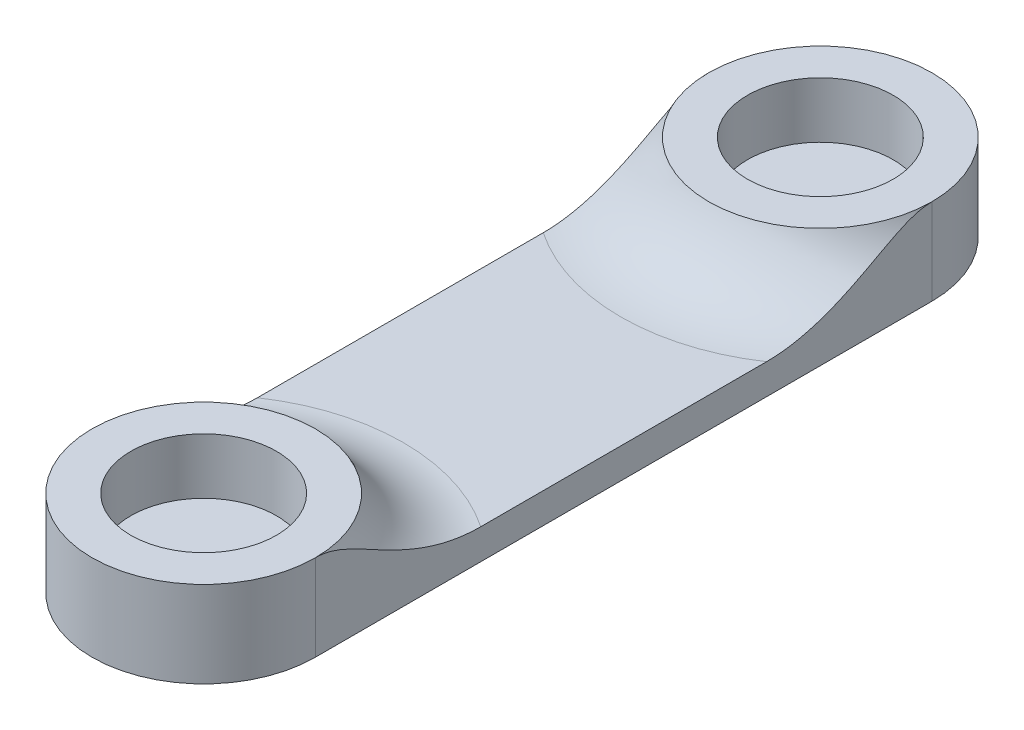
ISO-10303-21;
HEADER;
FILE_DESCRIPTION(('STEP AP214'),'2;1');
FILE_NAME('part.step','',(''),(''),'','','');
FILE_SCHEMA(('AUTOMOTIVE_DESIGN { 1 0 10303 214 1 1 1 1 }'));
ENDSEC;
DATA;
#1=APPLICATION_CONTEXT('core data for automotive mechanical design processes');
#2=APPLICATION_PROTOCOL_DEFINITION('international standard','automotive_design',2000,#1);
#3=PRODUCT_CONTEXT('',#1,'mechanical');
#4=PRODUCT('Part','Part','',(#3));
#5=PRODUCT_RELATED_PRODUCT_CATEGORY('part','',(#4));
#6=PRODUCT_DEFINITION_FORMATION('','',#4);
#7=PRODUCT_DEFINITION_CONTEXT('part definition',#1,'design');
#8=PRODUCT_DEFINITION('design','',#6,#7);
#9=PRODUCT_DEFINITION_SHAPE('','',#8);
#10=(LENGTH_UNIT() NAMED_UNIT(*) SI_UNIT(.MILLI.,.METRE.));
#11=(NAMED_UNIT(*) PLANE_ANGLE_UNIT() SI_UNIT($,.RADIAN.));
#12=(NAMED_UNIT(*) SI_UNIT($,.STERADIAN.) SOLID_ANGLE_UNIT());
#13=UNCERTAINTY_MEASURE_WITH_UNIT(LENGTH_MEASURE(1.E-05),#10,'distance_accuracy_value','');
#14=(GEOMETRIC_REPRESENTATION_CONTEXT(3) GLOBAL_UNCERTAINTY_ASSIGNED_CONTEXT((#13)) GLOBAL_UNIT_ASSIGNED_CONTEXT((#10,
#11,#12)) REPRESENTATION_CONTEXT('',''));
#15=CARTESIAN_POINT('',(0.,0.,0.));
#16=DIRECTION('',(0.,0.,1.));
#17=DIRECTION('',(1.,0.,0.));
#18=AXIS2_PLACEMENT_3D('',#15,#16,#17);
#19=CARTESIAN_POINT('',(11.5000000000002,3.125,0.));
#20=DIRECTION('',(1.,0.,0.));
#21=DIRECTION('',(0.,0.,-1.));
#22=AXIS2_PLACEMENT_3D('',#19,#20,#21);
#23=PLANE('',#22);
#24=DIRECTION('',(0.,0.,1.));
#25=VECTOR('',#24,1.);
#26=CARTESIAN_POINT('',(11.5000000000002,0.,0.));
#27=LINE('',#26,#25);
#28=CARTESIAN_POINT('',(11.5000000000001,0.,69.8377694053405));
#29=VERTEX_POINT('',#28);
#30=CARTESIAN_POINT('',(11.5,0.,133.337769405341));
#31=VERTEX_POINT('',#30);
#32=EDGE_CURVE('E122',#29,#31,#27,.T.);
#33=ORIENTED_EDGE('',*,*,#32,.F.);
#34=DIRECTION('',(0.,-1.,0.));
#35=VECTOR('',#34,1.);
#36=CARTESIAN_POINT('',(11.5000000000001,3.125,69.8377694053405));
#37=LINE('',#36,#35);
#38=CARTESIAN_POINT('',(11.5000000000001,8.875,69.8377694053405));
#39=VERTEX_POINT('',#38);
#40=EDGE_CURVE('E90',#39,#29,#37,.T.);
#41=ORIENTED_EDGE('',*,*,#40,.F.);
#42=CARTESIAN_POINT('',(11.5000000000001,8.875,69.8377694053405));
#43=CARTESIAN_POINT('',(11.5000000000001,8.875050444393,69.9559372586158));
#44=CARTESIAN_POINT('',(11.5000000000001,8.87112201090095,70.0740825368974));
#45=CARTESIAN_POINT('',(11.5000000000001,8.85569117906688,70.3097871266224));
#46=CARTESIAN_POINT('',(11.5000000000001,8.84419478510162,70.4273468282185));
#47=CARTESIAN_POINT('',(11.5000000000001,8.8141037882493,70.660805942659));
#48=CARTESIAN_POINT('',(11.5000000000001,8.79555340378253,70.7767111236764));
#49=CARTESIAN_POINT('',(11.5000000000001,8.75199388856233,71.007306201275));
#50=CARTESIAN_POINT('',(11.5000000000001,8.72698359163404,71.1219958745311));
#51=CARTESIAN_POINT('',(11.5000000000001,8.64469405397314,71.4584996609336));
#52=CARTESIAN_POINT('',(11.5000000000001,8.57936153879973,71.6783537783257));
#53=CARTESIAN_POINT('',(11.5000000000001,8.43245987879203,72.11278580347));
#54=CARTESIAN_POINT('',(11.5000000000001,8.35086353550935,72.327354187118));
#55=CARTESIAN_POINT('',(11.5000000000001,8.17818576713928,72.7473522243732));
#56=CARTESIAN_POINT('',(11.5000000000001,8.08733742917986,72.9528791405641));
#57=CARTESIAN_POINT('',(11.5000000000001,7.89837512792939,73.3603808016253));
#58=CARTESIAN_POINT('',(11.5000000000001,7.80026523252381,73.5623574580181));
#59=CARTESIAN_POINT('',(11.5000000000001,7.59833090743947,73.9660646544335));
#60=CARTESIAN_POINT('',(11.5000000000001,7.49445734251325,74.1677704045656));
#61=CARTESIAN_POINT('',(11.5000000000001,7.33660600021214,74.4692799252864));
#62=CARTESIAN_POINT('',(11.5000000000001,7.28364268413943,74.5696194087138));
#63=CARTESIAN_POINT('',(11.5000000000001,7.1772428557666,74.7700479897781));
#64=CARTESIAN_POINT('',(11.5000000000001,7.12380634149641,74.8701370863703));
#65=CARTESIAN_POINT('',(11.5000000000001,6.96148603707855,75.1731498010224));
#66=CARTESIAN_POINT('',(11.5000000000001,6.85216615355582,75.3758390944954));
#67=CARTESIAN_POINT('',(11.5000000000001,6.63370426935154,75.781308397426));
#68=CARTESIAN_POINT('',(11.5000000000001,6.5245622653556,75.9840884051015));
#69=CARTESIAN_POINT('',(11.5000000000001,6.30752755725519,76.3903301253352));
#70=CARTESIAN_POINT('',(11.5000000000001,6.1996349036205,76.5937918650081));
#71=CARTESIAN_POINT('',(11.5000000000001,5.98601824170027,77.001849326315));
#72=CARTESIAN_POINT('',(11.5000000000001,5.88029422261682,77.2064450422962));
#73=CARTESIAN_POINT('',(11.5000000000001,5.5674927188574,77.8227223737707));
#74=CARTESIAN_POINT('',(11.5000000000001,5.36488975807946,78.2367033003077));
#75=CARTESIAN_POINT('',(11.5000000000001,4.97723125747609,79.072807752167));
#76=CARTESIAN_POINT('',(11.5000000000001,4.79217215403367,79.4949296027997));
#77=CARTESIAN_POINT('',(11.5000000000001,4.53259975664316,80.132001246902));
#78=CARTESIAN_POINT('',(11.5000000000001,4.4496011959608,80.34350361401));
#79=CARTESIAN_POINT('',(11.5000000000001,4.28960220836265,80.7687610154406));
#80=CARTESIAN_POINT('',(11.5000000000001,4.21260175291884,80.9825160390435));
#81=CARTESIAN_POINT('',(11.5000000000001,3.99139404077143,81.6272359139242));
#82=CARTESIAN_POINT('',(11.5000000000001,3.85698819882183,82.0616367653662));
#83=CARTESIAN_POINT('',(11.5000000000001,3.61881930327255,82.9378589025068));
#84=CARTESIAN_POINT('',(11.5000000000001,3.51499464345764,83.3796633482625));
#85=CARTESIAN_POINT('',(11.5000000000001,3.34167591210046,84.2698432287244));
#86=CARTESIAN_POINT('',(11.5000000000001,3.2721625944747,84.7182148340743));
#87=CARTESIAN_POINT('',(11.5000000000001,3.19012248464069,85.4503352899869));
#88=CARTESIAN_POINT('',(11.5000000000001,3.16600236167557,85.7328114154928));
#89=CARTESIAN_POINT('',(11.5000000000001,3.13338640869582,86.3005051081535));
#90=CARTESIAN_POINT('',(11.5000000000001,3.12499348787062,86.58572854054));
#91=CARTESIAN_POINT('',(11.5000000000001,3.12499999999999,86.8710301145431));
#92=B_SPLINE_CURVE_WITH_KNOTS('',3,(#42,#43,#44,#45,#46,#47,#48,#49,#50,#51,#52,#53,#54,#55,#56,
#57,#58,#59,#60,#61,#62,#63,#64,#65,#66,#67,#68,#69,#70,#71,#72,#73,#74,#75,#76,#77,#78,#79,#80,
#81,#82,#83,#84,#85,#86,#87,#88,#89,#90,#91),.UNSPECIFIED.,.F.,.F.,(4,2,2,2,2,2,2,2,2,2,2,2,2,2,
2,2,2,2,2,2,2,2,2,2,4),(0.,0.354401916368265,0.708522990614682,1.06045988049477,
1.41246034819443,2.09956131502199,2.78782112896388,3.46173866196874,4.13528148646163,
4.81588716057301,5.15626612386294,5.49664650492903,6.18751773366032,6.87837593893701,
7.56926195600105,8.2601445322145,9.64256154527554,11.0246971488454,11.7062298333485,
12.387759276165,13.7508790949356,15.1112338082211,16.4708245951703,17.3209334239534,
18.1765856793096),.UNSPECIFIED.);
#93=CARTESIAN_POINT('',(11.5000000000001,3.125,86.8710301145431));
#94=VERTEX_POINT('',#93);
#95=EDGE_CURVE('E76',#39,#94,#92,.T.);
#96=ORIENTED_EDGE('',*,*,#95,.T.);
#97=DIRECTION('',(0.,0.,1.));
#98=VECTOR('',#97,1.);
#99=CARTESIAN_POINT('',(11.5000000000002,3.125,0.));
#100=LINE('',#99,#98);
#101=CARTESIAN_POINT('',(11.5,3.125,116.304508696138));
#102=VERTEX_POINT('',#101);
#103=EDGE_CURVE('E144',#94,#102,#100,.T.);
#104=ORIENTED_EDGE('',*,*,#103,.T.);
#105=CARTESIAN_POINT('',(11.5,3.125,116.304508696138));
#106=CARTESIAN_POINT('',(11.5,3.12499913645633,116.518277731837));
#107=CARTESIAN_POINT('',(11.5,3.12970880266678,116.732010506312));
#108=CARTESIAN_POINT('',(11.5,3.14819527820226,117.159046866335));
#109=CARTESIAN_POINT('',(11.5,3.1619704317495,117.372350523124));
#110=CARTESIAN_POINT('',(11.5,3.21630806551102,118.01051835788));
#111=CARTESIAN_POINT('',(11.5,3.26988502046805,118.43432572772));
#112=CARTESIAN_POINT('',(11.5,3.40752201371528,119.269632959358));
#113=CARTESIAN_POINT('',(11.5,3.49106331586735,119.681220451576));
#114=CARTESIAN_POINT('',(11.5,3.68564631793842,120.497954497458));
#115=CARTESIAN_POINT('',(11.5,3.79669884270729,120.903098448843));
#116=CARTESIAN_POINT('',(11.5,4.0788602453935,121.822606877342));
#117=CARTESIAN_POINT('',(11.5,4.25804286884376,122.334485105292));
#118=CARTESIAN_POINT('',(11.5,4.64951635630107,123.345311717461));
#119=CARTESIAN_POINT('',(11.5,4.86181176063844,123.844258317575));
#120=CARTESIAN_POINT('',(11.5,5.20030910075933,124.586444592015));
#121=CARTESIAN_POINT('',(11.5,5.31712987674578,124.834043693565));
#122=CARTESIAN_POINT('',(11.5,5.55609723089135,125.326659109889));
#123=CARTESIAN_POINT('',(11.5,5.67824378191834,125.571675437813));
#124=CARTESIAN_POINT('',(11.5,5.92662306211465,126.05955164418));
#125=CARTESIAN_POINT('',(11.5,6.05285493371626,126.302411961734));
#126=CARTESIAN_POINT('',(11.5,6.30806313368667,126.786694509469));
#127=CARTESIAN_POINT('',(11.5,6.43703959058828,127.028116671618));
#128=CARTESIAN_POINT('',(11.5,6.65622255280262,127.436139968902));
#129=CARTESIAN_POINT('',(11.5,6.74614191922323,127.60289631228));
#130=CARTESIAN_POINT('',(11.5,6.92585803482842,127.936474995792));
#131=CARTESIAN_POINT('',(11.5,7.01565478431065,128.103297335763));
#132=CARTESIAN_POINT('',(11.5,7.19435108596032,128.437401467729));
#133=CARTESIAN_POINT('',(11.5,7.28325072989689,128.604683210456));
#134=CARTESIAN_POINT('',(11.5,7.45922731926882,128.940200440349));
#135=CARTESIAN_POINT('',(11.5,7.54630432465824,129.108435895911));
#136=CARTESIAN_POINT('',(11.5,7.71628693944656,129.444064728396));
#137=CARTESIAN_POINT('',(11.5,7.79923380669044,129.61143708612));
#138=CARTESIAN_POINT('',(11.5,7.96082628498683,129.948237220952));
#139=CARTESIAN_POINT('',(11.5,8.03947240090385,130.117664753939));
#140=CARTESIAN_POINT('',(11.5,8.19062455910833,130.459053697983));
#141=CARTESIAN_POINT('',(11.5,8.26313684038462,130.631012320294));
#142=CARTESIAN_POINT('',(11.5,8.39986498144366,130.978172029683));
#143=CARTESIAN_POINT('',(11.5,8.46408378331467,131.153371941569));
#144=CARTESIAN_POINT('',(11.5,8.57598753571347,131.490737461242));
#145=CARTESIAN_POINT('',(11.5,8.62466134110846,131.652570707042));
#146=CARTESIAN_POINT('',(11.5,8.71070375361615,131.979148190223));
#147=CARTESIAN_POINT('',(11.5,8.74807961310813,132.143890488023));
#148=CARTESIAN_POINT('',(11.5,8.80990514677201,132.479117271523));
#149=CARTESIAN_POINT('',(11.5,8.83409468828528,132.649651348321));
#150=CARTESIAN_POINT('',(11.5,8.85851836790224,132.906786686225));
#151=CARTESIAN_POINT('',(11.5,8.86468311933437,132.992850472104));
#152=CARTESIAN_POINT('',(11.5,8.87292994876159,133.165194578622));
#153=CARTESIAN_POINT('',(11.5,8.87501099167864,133.25147494861));
#154=CARTESIAN_POINT('',(11.5,8.87499999999807,133.337769405341));
#155=B_SPLINE_CURVE_WITH_KNOTS('',3,(#105,#106,#107,#108,#109,#110,#111,#112,#113,#114,#115,
#116,#117,#118,#119,#120,#121,#122,#123,#124,#125,#126,#127,#128,#129,#130,#131,#132,#133,#134,
#135,#136,#137,#138,#139,#140,#141,#142,#143,#144,#145,#146,#147,#148,#149,#150,#151,#152,#153,
#154),.UNSPECIFIED.,.F.,.F.,(4,2,2,2,2,2,2,2,2,2,2,2,2,2,2,2,2,2,2,2,2,2,2,2,4),(0.,
0.641191317175831,1.28226555561504,2.56236150893507,3.82128908806437,5.08071280680445,
6.70624464721095,8.33199957217769,9.15327127251716,9.97453878938202,10.7956350144822,
11.6167697776743,12.1851351688871,12.7534991779546,13.3218044447049,13.8900909880917,
14.4504459286156,15.0107349473312,15.5704470418734,16.1299600315101,16.6366122908915,
17.142938625916,17.6589219453531,17.9176882869155,18.1765202082745),.UNSPECIFIED.);
#156=CARTESIAN_POINT('',(11.5,8.875,133.337769405341));
#157=VERTEX_POINT('',#156);
#158=EDGE_CURVE('E125',#102,#157,#155,.T.);
#159=ORIENTED_EDGE('',*,*,#158,.T.);
#160=DIRECTION('',(0.,-1.,0.));
#161=VECTOR('',#160,1.);
#162=CARTESIAN_POINT('',(11.5,3.125,133.337769405341));
#163=LINE('',#162,#161);
#164=EDGE_CURVE('E119',#157,#31,#163,.T.);
#165=ORIENTED_EDGE('',*,*,#164,.T.);
#166=EDGE_LOOP('',(#33,#41,#96,#104,#159,#165));
#167=FACE_BOUND('',#166,.T.);
#168=ADVANCED_FACE('F62',(#167),#23,.T.);
#169=CARTESIAN_POINT('',(-11.4999999999998,3.125,0.));
#170=DIRECTION('',(1.,0.,0.));
#171=DIRECTION('',(0.,0.,-1.));
#172=AXIS2_PLACEMENT_3D('',#169,#170,#171);
#173=PLANE('',#172);
#174=DIRECTION('',(0.,0.,1.));
#175=VECTOR('',#174,1.);
#176=CARTESIAN_POINT('',(-11.4999999999998,0.,0.));
#177=LINE('',#176,#175);
#178=CARTESIAN_POINT('',(-11.4999999999999,0.,69.8377694053405));
#179=VERTEX_POINT('',#178);
#180=CARTESIAN_POINT('',(-11.5,0.,133.337769405341));
#181=VERTEX_POINT('',#180);
#182=EDGE_CURVE('E142',#179,#181,#177,.T.);
#183=ORIENTED_EDGE('',*,*,#182,.T.);
#184=DIRECTION('',(0.,-1.,0.));
#185=VECTOR('',#184,1.);
#186=CARTESIAN_POINT('',(-11.5,3.125,133.337769405341));
#187=LINE('',#186,#185);
#188=CARTESIAN_POINT('',(-11.5,8.875,133.337769405341));
#189=VERTEX_POINT('',#188);
#190=EDGE_CURVE('E135',#189,#181,#187,.T.);
#191=ORIENTED_EDGE('',*,*,#190,.F.);
#192=CARTESIAN_POINT('',(-11.5,8.875,133.337769405341));
#193=CARTESIAN_POINT('',(-11.5,8.875050444393,133.219601552065));
#194=CARTESIAN_POINT('',(-11.5,8.87112201090094,133.101456273784));
#195=CARTESIAN_POINT('',(-11.5,8.85569117906687,132.865751684059));
#196=CARTESIAN_POINT('',(-11.5,8.84419478510162,132.748191982463));
#197=CARTESIAN_POINT('',(-11.5,8.8141037882493,132.514732868022));
#198=CARTESIAN_POINT('',(-11.5,8.79555340378253,132.398827687005));
#199=CARTESIAN_POINT('',(-11.5,8.75199388856232,132.168232609406));
#200=CARTESIAN_POINT('',(-11.5,8.72698359163404,132.05354293615));
#201=CARTESIAN_POINT('',(-11.5,8.64469405397315,131.717039149747));
#202=CARTESIAN_POINT('',(-11.5,8.57936153879973,131.497185032355));
#203=CARTESIAN_POINT('',(-11.5,8.43245987879203,131.062753007211));
#204=CARTESIAN_POINT('',(-11.5,8.35086353550934,130.848184623563));
#205=CARTESIAN_POINT('',(-11.5,8.17818576713927,130.428186586308));
#206=CARTESIAN_POINT('',(-11.5,8.08733742917985,130.222659670117));
#207=CARTESIAN_POINT('',(-11.5,7.89837512792939,129.815158009056));
#208=CARTESIAN_POINT('',(-11.5,7.8002652325238,129.613181352663));
#209=CARTESIAN_POINT('',(-11.5,7.59833090743946,129.209474156247));
#210=CARTESIAN_POINT('',(-11.5,7.49445734251324,129.007768406115));
#211=CARTESIAN_POINT('',(-11.5,7.33660600021214,128.706258885395));
#212=CARTESIAN_POINT('',(-11.5,7.28364268413943,128.605919401967));
#213=CARTESIAN_POINT('',(-11.5,7.1772428557666,128.405490820903));
#214=CARTESIAN_POINT('',(-11.5,7.1238063414964,128.305401724311));
#215=CARTESIAN_POINT('',(-11.5,6.96148603707853,128.002389009659));
#216=CARTESIAN_POINT('',(-11.5,6.8521661535558,127.799699716186));
#217=CARTESIAN_POINT('',(-11.5,6.63370426935152,127.394230413255));
#218=CARTESIAN_POINT('',(-11.5,6.52456226535557,127.19145040558));
#219=CARTESIAN_POINT('',(-11.5,6.30752755725516,126.785208685346));
#220=CARTESIAN_POINT('',(-11.5,6.19963490362047,126.581746945673));
#221=CARTESIAN_POINT('',(-11.5,5.98601824170025,126.173689484366));
#222=CARTESIAN_POINT('',(-11.5,5.88029422261679,125.969093768385));
#223=CARTESIAN_POINT('',(-11.5,5.56749271885738,125.35281643691));
#224=CARTESIAN_POINT('',(-11.5,5.36488975807943,124.938835510373));
#225=CARTESIAN_POINT('',(-11.5,4.97723125747607,124.102731058514));
#226=CARTESIAN_POINT('',(-11.5,4.79217215403365,123.680609207881));
#227=CARTESIAN_POINT('',(-11.5,4.53259975664315,123.043537563779));
#228=CARTESIAN_POINT('',(-11.5,4.44960119596079,122.832035196671));
#229=CARTESIAN_POINT('',(-11.5,4.28960220836264,122.40677779524));
#230=CARTESIAN_POINT('',(-11.5,4.21260175291883,122.193022771638));
#231=CARTESIAN_POINT('',(-11.5,3.99139404077142,121.548302896757));
#232=CARTESIAN_POINT('',(-11.5,3.85698819882182,121.113902045315));
#233=CARTESIAN_POINT('',(-11.5,3.61881930327254,120.237679908174));
#234=CARTESIAN_POINT('',(-11.5,3.51499464345763,119.795875462418));
#235=CARTESIAN_POINT('',(-11.5,3.34167591210046,118.905695581957));
#236=CARTESIAN_POINT('',(-11.5,3.27216259447469,118.457323976607));
#237=CARTESIAN_POINT('',(-11.5,3.19012248464069,117.725203520694));
#238=CARTESIAN_POINT('',(-11.5,3.16600236167557,117.442727395188));
#239=CARTESIAN_POINT('',(-11.5,3.13338640869582,116.875033702527));
#240=CARTESIAN_POINT('',(-11.5,3.12499348787062,116.589810270141));
#241=CARTESIAN_POINT('',(-11.5,3.125,116.304508696138));
#242=B_SPLINE_CURVE_WITH_KNOTS('',3,(#192,#193,#194,#195,#196,#197,#198,#199,#200,#201,#202,
#203,#204,#205,#206,#207,#208,#209,#210,#211,#212,#213,#214,#215,#216,#217,#218,#219,#220,#221,
#222,#223,#224,#225,#226,#227,#228,#229,#230,#231,#232,#233,#234,#235,#236,#237,#238,#239,#240,
#241),.UNSPECIFIED.,.F.,.F.,(4,2,2,2,2,2,2,2,2,2,2,2,2,2,2,2,2,2,2,2,2,2,2,2,4),(0.,
0.354401916368223,0.708522990614654,1.06045988049474,1.4124603481944,2.09956131502196,
2.78782112896388,3.46173866196874,4.13528148646164,4.81588716057301,5.15626612386295,
5.49664650492903,6.18751773366037,6.87837593893707,7.56926195600111,8.26014453221455,
9.64256154527559,11.0246971488454,11.7062298333485,12.387759276165,13.7508790949356,
15.1112338082211,16.4708245951703,17.3209334239534,18.1765856793096),.UNSPECIFIED.);
#243=CARTESIAN_POINT('',(-11.5,3.125,116.304508696138));
#244=VERTEX_POINT('',#243);
#245=EDGE_CURVE('E160',#189,#244,#242,.T.);
#246=ORIENTED_EDGE('',*,*,#245,.T.);
#247=DIRECTION('',(0.,0.,1.));
#248=VECTOR('',#247,1.);
#249=CARTESIAN_POINT('',(-11.4999999999998,3.125,0.));
#250=LINE('',#249,#248);
#251=CARTESIAN_POINT('',(-11.4999999999999,3.125,86.871030114543));
#252=VERTEX_POINT('',#251);
#253=EDGE_CURVE('E149',#252,#244,#250,.T.);
#254=ORIENTED_EDGE('',*,*,#253,.F.);
#255=CARTESIAN_POINT('',(-11.4999999999999,3.125,86.871030114543));
#256=CARTESIAN_POINT('',(-11.4999999999999,3.12499913645634,86.6572610788436));
#257=CARTESIAN_POINT('',(-11.4999999999999,3.12970880266679,86.4435283043687));
#258=CARTESIAN_POINT('',(-11.4999999999999,3.14819527820226,86.0164919443462));
#259=CARTESIAN_POINT('',(-11.4999999999999,3.1619704317495,85.8031882875568));
#260=CARTESIAN_POINT('',(-11.4999999999999,3.21630806551102,85.1650204528014));
#261=CARTESIAN_POINT('',(-11.4999999999999,3.26988502046805,84.7412130829609));
#262=CARTESIAN_POINT('',(-11.4999999999999,3.40752201371528,83.9059058513225));
#263=CARTESIAN_POINT('',(-11.4999999999999,3.49106331586735,83.4943183591051));
#264=CARTESIAN_POINT('',(-11.4999999999999,3.68564631793842,82.6775843132233));
#265=CARTESIAN_POINT('',(-11.4999999999999,3.79669884270729,82.2724403618383));
#266=CARTESIAN_POINT('',(-11.4999999999999,4.0788602453935,81.3529319333395));
#267=CARTESIAN_POINT('',(-11.4999999999999,4.25804286884376,80.8410537053895));
#268=CARTESIAN_POINT('',(-11.4999999999999,4.64951635630107,79.8302270932201));
#269=CARTESIAN_POINT('',(-11.4999999999999,4.86181176063844,79.3312804931061));
#270=CARTESIAN_POINT('',(-11.4999999999999,5.20030910075933,78.5890942186661));
#271=CARTESIAN_POINT('',(-11.4999999999999,5.31712987674578,78.3414951171164));
#272=CARTESIAN_POINT('',(-11.4999999999999,5.55609723089135,77.8488797007924));
#273=CARTESIAN_POINT('',(-11.4999999999999,5.67824378191834,77.6038633728681));
#274=CARTESIAN_POINT('',(-11.4999999999999,5.92662306211465,77.1159871665015));
#275=CARTESIAN_POINT('',(-11.4999999999999,6.05285493371624,76.873126848947));
#276=CARTESIAN_POINT('',(-11.4999999999999,6.30806313368666,76.3888443012119));
#277=CARTESIAN_POINT('',(-11.4999999999999,6.43703959058827,76.1474221390626));
#278=CARTESIAN_POINT('',(-11.4999999999999,6.65622255280261,75.7393988417793));
#279=CARTESIAN_POINT('',(-11.4999999999999,6.74614191922321,75.5726424984008));
#280=CARTESIAN_POINT('',(-11.4999999999999,6.9258580348284,75.2390638148895));
#281=CARTESIAN_POINT('',(-11.4999999999999,7.01565478431063,75.072241474918));
#282=CARTESIAN_POINT('',(-11.4999999999999,7.1943510859603,74.7381373429517));
#283=CARTESIAN_POINT('',(-11.4999999999999,7.28325072989688,74.5708556002246));
#284=CARTESIAN_POINT('',(-11.4999999999999,7.45922731926881,74.2353383703322));
#285=CARTESIAN_POINT('',(-11.4999999999999,7.54630432465823,74.0671029147704));
#286=CARTESIAN_POINT('',(-11.4999999999999,7.71628693944656,73.7314740822847));
#287=CARTESIAN_POINT('',(-11.4999999999999,7.79923380669044,73.5641017245611));
#288=CARTESIAN_POINT('',(-11.4999999999999,7.96082628498683,73.2273015897288));
#289=CARTESIAN_POINT('',(-11.4999999999999,8.03947240090385,73.0578740567422));
#290=CARTESIAN_POINT('',(-11.4999999999999,8.19062455910833,72.7164851126976));
#291=CARTESIAN_POINT('',(-11.4999999999999,8.26313684038462,72.544526490387));
#292=CARTESIAN_POINT('',(-11.4999999999999,8.39986498144365,72.1973667809977));
#293=CARTESIAN_POINT('',(-11.4999999999999,8.46408378331467,72.0221668691125));
#294=CARTESIAN_POINT('',(-11.4999999999999,8.57598753571347,71.6848013494395));
#295=CARTESIAN_POINT('',(-11.4999999999999,8.62466134110846,71.5229681036393));
#296=CARTESIAN_POINT('',(-11.4999999999999,8.71070375361616,71.1963906204577));
#297=CARTESIAN_POINT('',(-11.4999999999999,8.74807961310813,71.0316483226585));
#298=CARTESIAN_POINT('',(-11.4999999999999,8.80990514677201,70.6964215391584));
#299=CARTESIAN_POINT('',(-11.4999999999999,8.83409468828529,70.52588746236));
#300=CARTESIAN_POINT('',(-11.4999999999999,8.85851836790224,70.2687521244561));
#301=CARTESIAN_POINT('',(-11.4999999999999,8.86468311933438,70.1826883385767));
#302=CARTESIAN_POINT('',(-11.4999999999999,8.87292994876159,70.0103442320587));
#303=CARTESIAN_POINT('',(-11.4999999999999,8.87501099167864,69.9240638620708));
#304=CARTESIAN_POINT('',(-11.4999999999999,8.87499999999807,69.8377694053398));
#305=B_SPLINE_CURVE_WITH_KNOTS('',3,(#255,#256,#257,#258,#259,#260,#261,#262,#263,#264,#265,
#266,#267,#268,#269,#270,#271,#272,#273,#274,#275,#276,#277,#278,#279,#280,#281,#282,#283,#284,
#285,#286,#287,#288,#289,#290,#291,#292,#293,#294,#295,#296,#297,#298,#299,#300,#301,#302,#303,
#304),.UNSPECIFIED.,.F.,.F.,(4,2,2,2,2,2,2,2,2,2,2,2,2,2,2,2,2,2,2,2,2,2,2,2,4),(0.,
0.641191317175845,1.28226555561504,2.56236150893507,3.82128908806437,5.08071280680446,
6.70624464721096,8.33199957217769,9.15327127251716,9.97453878938201,10.7956350144822,
11.6167697776743,12.185135168887,12.7534991779546,13.3218044447049,13.8900909880917,
14.4504459286157,15.0107349473312,15.5704470418734,16.1299600315101,16.6366122908915,
17.142938625916,17.6589219453531,17.9176882869155,18.1765202082745),.UNSPECIFIED.);
#306=CARTESIAN_POINT('',(-11.4999999999999,8.875,69.8377694053405));
#307=VERTEX_POINT('',#306);
#308=EDGE_CURVE('E12',#252,#307,#305,.T.);
#309=ORIENTED_EDGE('',*,*,#308,.T.);
#310=DIRECTION('',(0.,-1.,0.));
#311=VECTOR('',#310,1.);
#312=CARTESIAN_POINT('',(-11.4999999999999,3.125,69.8377694053405));
#313=LINE('',#312,#311);
#314=EDGE_CURVE('E83',#307,#179,#313,.T.);
#315=ORIENTED_EDGE('',*,*,#314,.T.);
#316=EDGE_LOOP('',(#183,#191,#246,#254,#309,#315));
#317=FACE_BOUND('',#316,.T.);
#318=ADVANCED_FACE('F171',(#317),#173,.F.);
#319=CARTESIAN_POINT('',(0.,3.125,133.337769405341));
#320=DIRECTION('',(0.,-1.,0.));
#321=DIRECTION('',(0.,0.,-1.));
#322=AXIS2_PLACEMENT_3D('',#319,#320,#321);
#323=CYLINDRICAL_SURFACE('',#322,11.5);
#324=CARTESIAN_POINT('',(0.,8.875,133.337769405341));
#325=DIRECTION('',(0.,1.,0.));
#326=DIRECTION('',(0.,0.,1.));
#327=AXIS2_PLACEMENT_3D('',#324,#325,#326);
#328=CIRCLE('',#327,11.5);
#329=EDGE_CURVE('E220',#189,#157,#328,.T.);
#330=ORIENTED_EDGE('',*,*,#329,.F.);
#331=ORIENTED_EDGE('',*,*,#190,.T.);
#332=CARTESIAN_POINT('',(0.,0.,133.337769405341));
#333=DIRECTION('',(0.,1.,0.));
#334=DIRECTION('',(0.,0.,1.));
#335=AXIS2_PLACEMENT_3D('',#332,#333,#334);
#336=CIRCLE('',#335,11.5);
#337=EDGE_CURVE('E133',#181,#31,#336,.T.);
#338=ORIENTED_EDGE('',*,*,#337,.T.);
#339=ORIENTED_EDGE('',*,*,#164,.F.);
#340=EDGE_LOOP('',(#330,#331,#338,#339));
#341=FACE_BOUND('',#340,.T.);
#342=ADVANCED_FACE('F134',(#341),#323,.T.);
#343=CARTESIAN_POINT('',(0.,0.,0.));
#344=DIRECTION('',(0.,1.,0.));
#345=DIRECTION('',(0.,0.,1.));
#346=AXIS2_PLACEMENT_3D('',#343,#344,#345);
#347=PLANE('',#346);
#348=ORIENTED_EDGE('',*,*,#337,.F.);
#349=ORIENTED_EDGE('',*,*,#182,.F.);
#350=CARTESIAN_POINT('',(0.,0.,69.8377694053405));
#351=DIRECTION('',(0.,1.,0.));
#352=DIRECTION('',(0.,0.,1.));
#353=AXIS2_PLACEMENT_3D('',#350,#351,#352);
#354=CIRCLE('',#353,11.5);
#355=EDGE_CURVE('E138',#29,#179,#354,.T.);
#356=ORIENTED_EDGE('',*,*,#355,.F.);
#357=ORIENTED_EDGE('',*,*,#32,.T.);
#358=EDGE_LOOP('',(#348,#349,#356,#357));
#359=FACE_BOUND('',#358,.T.);
#360=ADVANCED_FACE('F141',(#359),#347,.F.);
#361=CARTESIAN_POINT('',(0.,3.125,0.));
#362=DIRECTION('',(0.,1.,0.));
#363=DIRECTION('',(0.,0.,1.));
#364=AXIS2_PLACEMENT_3D('',#361,#362,#363);
#365=PLANE('',#364);
#366=ORIENTED_EDGE('',*,*,#253,.T.);
#367=CARTESIAN_POINT('',(0.,3.125,133.337769405341));
#368=DIRECTION('',(0.,1.,0.));
#369=DIRECTION('',(0.,0.,1.));
#370=AXIS2_PLACEMENT_3D('',#367,#368,#369);
#371=CIRCLE('',#370,20.5519334951158);
#372=EDGE_CURVE('E158',#244,#102,#371,.F.);
#373=ORIENTED_EDGE('',*,*,#372,.T.);
#374=ORIENTED_EDGE('',*,*,#103,.F.);
#375=CARTESIAN_POINT('',(0.,3.125,69.8377694053405));
#376=DIRECTION('',(0.,1.,0.));
#377=DIRECTION('',(0.,0.,1.));
#378=AXIS2_PLACEMENT_3D('',#375,#376,#377);
#379=CIRCLE('',#378,20.5519334951158);
#380=EDGE_CURVE('E156',#94,#252,#379,.F.);
#381=ORIENTED_EDGE('',*,*,#380,.T.);
#382=EDGE_LOOP('',(#366,#373,#374,#381));
#383=FACE_BOUND('',#382,.T.);
#384=ADVANCED_FACE('F185',(#383),#365,.T.);
#385=CARTESIAN_POINT('',(0.,3.125,69.8377694053405));
#386=DIRECTION('',(0.,-1.,0.));
#387=DIRECTION('',(0.,0.,-1.));
#388=AXIS2_PLACEMENT_3D('',#385,#386,#387);
#389=CYLINDRICAL_SURFACE('',#388,11.5);
#390=CARTESIAN_POINT('',(0.,8.875,69.8377694053405));
#391=DIRECTION('',(0.,1.,0.));
#392=DIRECTION('',(0.,0.,1.));
#393=AXIS2_PLACEMENT_3D('',#390,#391,#392);
#394=CIRCLE('',#393,11.5);
#395=EDGE_CURVE('E153',#39,#307,#394,.T.);
#396=ORIENTED_EDGE('',*,*,#395,.F.);
#397=ORIENTED_EDGE('',*,*,#40,.T.);
#398=ORIENTED_EDGE('',*,*,#355,.T.);
#399=ORIENTED_EDGE('',*,*,#314,.F.);
#400=EDGE_LOOP('',(#396,#397,#398,#399));
#401=FACE_BOUND('',#400,.T.);
#402=ADVANCED_FACE('F180',(#401),#389,.T.);
#403=CARTESIAN_POINT('',(0.,8.875,69.8377694053405));
#404=DIRECTION('',(0.,1.,0.));
#405=DIRECTION('',(0.,0.,1.));
#406=AXIS2_PLACEMENT_3D('',#403,#404,#405);
#407=PLANE('',#406);
#408=ORIENTED_EDGE('',*,*,#395,.T.);
#409=EDGE_CURVE('E205',#307,#39,#394,.T.);
#410=ORIENTED_EDGE('',*,*,#409,.T.);
#411=EDGE_LOOP('',(#408,#410));
#412=FACE_BOUND('',#411,.T.);
#413=CARTESIAN_POINT('',(0.,8.875,69.8377694053405));
#414=DIRECTION('',(0.,1.,0.));
#415=DIRECTION('',(0.,0.,1.));
#416=AXIS2_PLACEMENT_3D('',#413,#414,#415);
#417=CIRCLE('',#416,7.5);
#418=CARTESIAN_POINT('',(0.,8.875,77.3377694053405));
#419=VERTEX_POINT('',#418);
#420=EDGE_CURVE('E211',#419,#419,#417,.T.);
#421=ORIENTED_EDGE('',*,*,#420,.F.);
#422=EDGE_LOOP('',(#421));
#423=FACE_BOUND('',#422,.T.);
#424=ADVANCED_FACE('F184',(#412,#423),#407,.T.);
#425=CARTESIAN_POINT('',(0.,8.875,69.8377694053405));
#426=DIRECTION('',(0.,-1.,0.));
#427=DIRECTION('',(0.,0.,-1.));
#428=AXIS2_PLACEMENT_3D('',#425,#426,#427);
#429=CYLINDRICAL_SURFACE('',#428,7.5);
#430=ORIENTED_EDGE('',*,*,#420,.T.);
#431=EDGE_LOOP('',(#430));
#432=FACE_BOUND('',#431,.T.);
#433=CARTESIAN_POINT('',(0.,3.125,69.8377694053405));
#434=DIRECTION('',(0.,1.,0.));
#435=DIRECTION('',(0.,0.,1.));
#436=AXIS2_PLACEMENT_3D('',#433,#434,#435);
#437=CIRCLE('',#436,7.5);
#438=CARTESIAN_POINT('',(0.,3.125,77.3377694053405));
#439=VERTEX_POINT('',#438);
#440=EDGE_CURVE('E213',#439,#439,#437,.T.);
#441=ORIENTED_EDGE('',*,*,#440,.F.);
#442=EDGE_LOOP('',(#441));
#443=FACE_BOUND('',#442,.T.);
#444=ADVANCED_FACE('F228',(#432,#443),#429,.F.);
#445=ORIENTED_EDGE('',*,*,#440,.T.);
#446=EDGE_LOOP('',(#445));
#447=FACE_BOUND('',#446,.T.);
#448=ADVANCED_FACE('F235',(#447),#365,.T.);
#449=CARTESIAN_POINT('',(0.,8.875,133.337769405341));
#450=DIRECTION('',(0.,1.,0.));
#451=DIRECTION('',(0.,0.,1.));
#452=AXIS2_PLACEMENT_3D('',#449,#450,#451);
#453=PLANE('',#452);
#454=EDGE_CURVE('E218',#157,#189,#328,.T.);
#455=ORIENTED_EDGE('',*,*,#454,.T.);
#456=ORIENTED_EDGE('',*,*,#329,.T.);
#457=EDGE_LOOP('',(#455,#456));
#458=FACE_BOUND('',#457,.T.);
#459=CARTESIAN_POINT('',(0.,8.875,133.337769405341));
#460=DIRECTION('',(0.,1.,0.));
#461=DIRECTION('',(0.,0.,1.));
#462=AXIS2_PLACEMENT_3D('',#459,#460,#461);
#463=CIRCLE('',#462,7.5);
#464=CARTESIAN_POINT('',(0.,8.875,140.837769405341));
#465=VERTEX_POINT('',#464);
#466=EDGE_CURVE('E223',#465,#465,#463,.T.);
#467=ORIENTED_EDGE('',*,*,#466,.F.);
#468=EDGE_LOOP('',(#467));
#469=FACE_BOUND('',#468,.T.);
#470=ADVANCED_FACE('F268',(#458,#469),#453,.T.);
#471=CARTESIAN_POINT('',(0.,8.875,133.337769405341));
#472=DIRECTION('',(0.,-1.,0.));
#473=DIRECTION('',(0.,0.,-1.));
#474=AXIS2_PLACEMENT_3D('',#471,#472,#473);
#475=CYLINDRICAL_SURFACE('',#474,7.5);
#476=ORIENTED_EDGE('',*,*,#466,.T.);
#477=EDGE_LOOP('',(#476));
#478=FACE_BOUND('',#477,.T.);
#479=CARTESIAN_POINT('',(0.,3.125,133.337769405341));
#480=DIRECTION('',(0.,1.,0.));
#481=DIRECTION('',(0.,0.,1.));
#482=AXIS2_PLACEMENT_3D('',#479,#480,#481);
#483=CIRCLE('',#482,7.5);
#484=CARTESIAN_POINT('',(0.,3.125,140.837769405341));
#485=VERTEX_POINT('',#484);
#486=EDGE_CURVE('E129',#485,#485,#483,.F.);
#487=ORIENTED_EDGE('',*,*,#486,.T.);
#488=EDGE_LOOP('',(#487));
#489=FACE_BOUND('',#488,.T.);
#490=ADVANCED_FACE('F273',(#478,#489),#475,.F.);
#491=ORIENTED_EDGE('',*,*,#486,.F.);
#492=EDGE_LOOP('',(#491));
#493=FACE_BOUND('',#492,.T.);
#494=ADVANCED_FACE('F178',(#493),#365,.T.);
#495=CARTESIAN_POINT('',(0.,13.125,133.337769405341));
#496=DIRECTION('',(0.,1.,0.));
#497=DIRECTION('',(0.,0.,1.));
#498=AXIS2_PLACEMENT_3D('',#495,#496,#497);
#499=TOROIDAL_SURFACE('',#498,20.5519334951158,10.);
#500=ORIENTED_EDGE('',*,*,#158,.F.);
#501=ORIENTED_EDGE('',*,*,#372,.F.);
#502=ORIENTED_EDGE('',*,*,#245,.F.);
#503=ORIENTED_EDGE('',*,*,#454,.F.);
#504=EDGE_LOOP('',(#500,#501,#502,#503));
#505=FACE_BOUND('',#504,.T.);
#506=ADVANCED_FACE('F174',(#505),#499,.F.);
#507=CARTESIAN_POINT('',(0.,13.125,69.8377694053405));
#508=DIRECTION('',(0.,1.,0.));
#509=DIRECTION('',(0.,0.,1.));
#510=AXIS2_PLACEMENT_3D('',#507,#508,#509);
#511=TOROIDAL_SURFACE('',#510,20.5519334951158,10.);
#512=ORIENTED_EDGE('',*,*,#308,.F.);
#513=ORIENTED_EDGE('',*,*,#380,.F.);
#514=ORIENTED_EDGE('',*,*,#95,.F.);
#515=ORIENTED_EDGE('',*,*,#409,.F.);
#516=EDGE_LOOP('',(#512,#513,#514,#515));
#517=FACE_BOUND('',#516,.T.);
#518=ADVANCED_FACE('F64',(#517),#511,.F.);
#519=CLOSED_SHELL('',(#168,#318,#342,#360,#384,#402,#424,#444,#448,#470,#490,#494,#506,#518));
#520=MANIFOLD_SOLID_BREP('B2',#519);
#521=ADVANCED_BREP_SHAPE_REPRESENTATION('',(#18,#520),#14);
#522=SHAPE_DEFINITION_REPRESENTATION(#9,#521);
ENDSEC;
END-ISO-10303-21;
